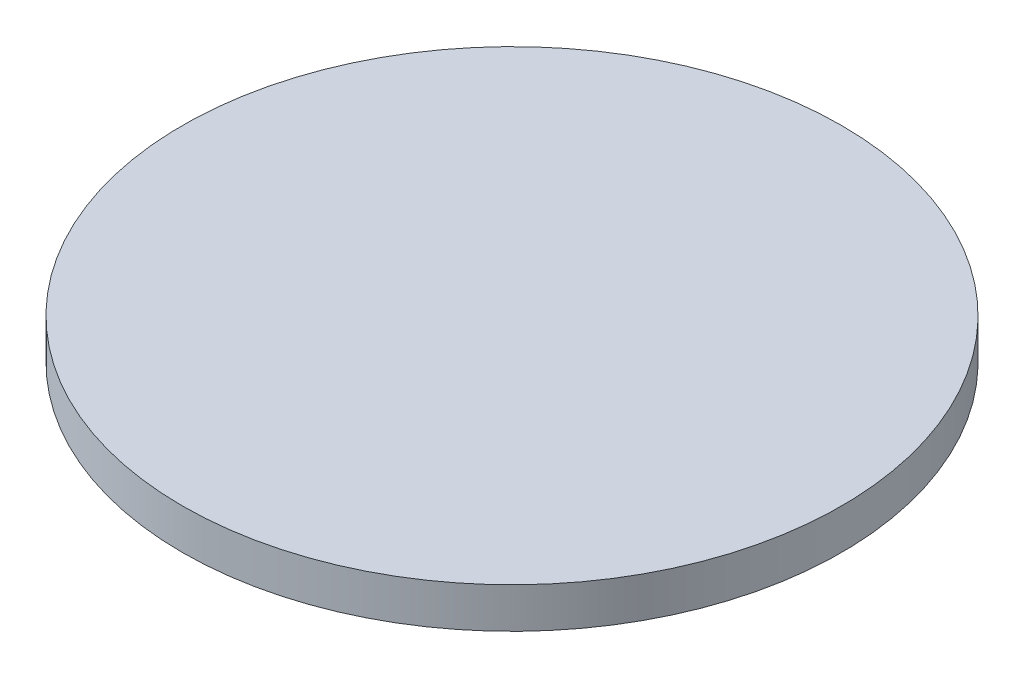
ISO-10303-21;
HEADER;
FILE_DESCRIPTION(('STEP AP214'),'2;1');
FILE_NAME('part.step','',(''),(''),'','','');
FILE_SCHEMA(('AUTOMOTIVE_DESIGN { 1 0 10303 214 1 1 1 1 }'));
ENDSEC;
DATA;
#1=APPLICATION_CONTEXT('core data for automotive mechanical design processes');
#2=APPLICATION_PROTOCOL_DEFINITION('international standard','automotive_design',2000,#1);
#3=PRODUCT_CONTEXT('',#1,'mechanical');
#4=PRODUCT('Part','Part','',(#3));
#5=PRODUCT_RELATED_PRODUCT_CATEGORY('part','',(#4));
#6=PRODUCT_DEFINITION_FORMATION('','',#4);
#7=PRODUCT_DEFINITION_CONTEXT('part definition',#1,'design');
#8=PRODUCT_DEFINITION('design','',#6,#7);
#9=PRODUCT_DEFINITION_SHAPE('','',#8);
#10=(LENGTH_UNIT() NAMED_UNIT(*) SI_UNIT(.MILLI.,.METRE.));
#11=(NAMED_UNIT(*) PLANE_ANGLE_UNIT() SI_UNIT($,.RADIAN.));
#12=(NAMED_UNIT(*) SI_UNIT($,.STERADIAN.) SOLID_ANGLE_UNIT());
#13=UNCERTAINTY_MEASURE_WITH_UNIT(LENGTH_MEASURE(1.E-05),#10,'distance_accuracy_value','');
#14=(GEOMETRIC_REPRESENTATION_CONTEXT(3) GLOBAL_UNCERTAINTY_ASSIGNED_CONTEXT((#13)) GLOBAL_UNIT_ASSIGNED_CONTEXT((#10,
#11,#12)) REPRESENTATION_CONTEXT('',''));
#15=CARTESIAN_POINT('',(0.,0.,0.));
#16=DIRECTION('',(0.,0.,1.));
#17=DIRECTION('',(1.,0.,0.));
#18=AXIS2_PLACEMENT_3D('',#15,#16,#17);
#19=CARTESIAN_POINT('',(0.,3.,0.));
#20=DIRECTION('',(0.,-1.,0.));
#21=DIRECTION('',(0.,0.,-1.));
#22=AXIS2_PLACEMENT_3D('',#19,#20,#21);
#23=CYLINDRICAL_SURFACE('',#22,24.5);
#24=CARTESIAN_POINT('',(0.,3.,0.));
#25=DIRECTION('',(0.,1.,0.));
#26=DIRECTION('',(0.,0.,1.));
#27=AXIS2_PLACEMENT_3D('',#24,#25,#26);
#28=CIRCLE('',#27,24.5);
#29=CARTESIAN_POINT('',(0.,3.,24.5));
#30=VERTEX_POINT('',#29);
#31=EDGE_CURVE('E10',#30,#30,#28,.T.);
#32=ORIENTED_EDGE('',*,*,#31,.F.);
#33=EDGE_LOOP('',(#32));
#34=FACE_BOUND('',#33,.T.);
#35=CARTESIAN_POINT('',(0.,0.,0.));
#36=DIRECTION('',(0.,1.,0.));
#37=DIRECTION('',(0.,0.,1.));
#38=AXIS2_PLACEMENT_3D('',#35,#36,#37);
#39=CIRCLE('',#38,24.5);
#40=CARTESIAN_POINT('',(0.,0.,24.5));
#41=VERTEX_POINT('',#40);
#42=EDGE_CURVE('E36',#41,#41,#39,.T.);
#43=ORIENTED_EDGE('',*,*,#42,.T.);
#44=EDGE_LOOP('',(#43));
#45=FACE_BOUND('',#44,.T.);
#46=ADVANCED_FACE('F33',(#34,#45),#23,.T.);
#47=CARTESIAN_POINT('',(0.,3.,0.));
#48=DIRECTION('',(0.,1.,0.));
#49=DIRECTION('',(0.,0.,1.));
#50=AXIS2_PLACEMENT_3D('',#47,#48,#49);
#51=PLANE('',#50);
#52=ORIENTED_EDGE('',*,*,#31,.T.);
#53=EDGE_LOOP('',(#52));
#54=FACE_BOUND('',#53,.T.);
#55=ADVANCED_FACE('F48',(#54),#51,.T.);
#56=CARTESIAN_POINT('',(0.,0.,0.));
#57=DIRECTION('',(0.,1.,0.));
#58=DIRECTION('',(0.,0.,1.));
#59=AXIS2_PLACEMENT_3D('',#56,#57,#58);
#60=PLANE('',#59);
#61=ORIENTED_EDGE('',*,*,#42,.F.);
#62=EDGE_LOOP('',(#61));
#63=FACE_BOUND('',#62,.T.);
#64=ADVANCED_FACE('F46',(#63),#60,.F.);
#65=CLOSED_SHELL('',(#46,#55,#64));
#66=MANIFOLD_SOLID_BREP('B2',#65);
#67=ADVANCED_BREP_SHAPE_REPRESENTATION('',(#18,#66),#14);
#68=SHAPE_DEFINITION_REPRESENTATION(#9,#67);
ENDSEC;
END-ISO-10303-21;
